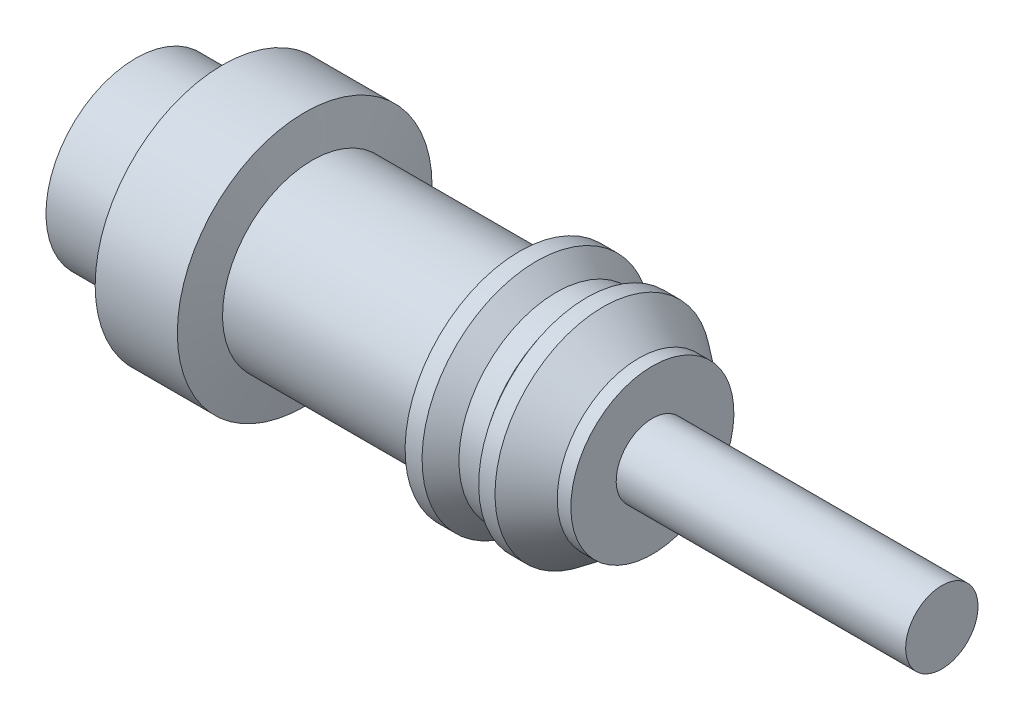
ISO-10303-21;
HEADER;
FILE_DESCRIPTION(('STEP AP214'),'2;1');
FILE_NAME('part.step','',(''),(''),'','','');
FILE_SCHEMA(('AUTOMOTIVE_DESIGN { 1 0 10303 214 1 1 1 1 }'));
ENDSEC;
DATA;
#1=APPLICATION_CONTEXT('core data for automotive mechanical design processes');
#2=APPLICATION_PROTOCOL_DEFINITION('international standard','automotive_design',2000,#1);
#3=PRODUCT_CONTEXT('',#1,'mechanical');
#4=PRODUCT('Part','Part','',(#3));
#5=PRODUCT_RELATED_PRODUCT_CATEGORY('part','',(#4));
#6=PRODUCT_DEFINITION_FORMATION('','',#4);
#7=PRODUCT_DEFINITION_CONTEXT('part definition',#1,'design');
#8=PRODUCT_DEFINITION('design','',#6,#7);
#9=PRODUCT_DEFINITION_SHAPE('','',#8);
#10=(LENGTH_UNIT() NAMED_UNIT(*) SI_UNIT(.MILLI.,.METRE.));
#11=(NAMED_UNIT(*) PLANE_ANGLE_UNIT() SI_UNIT($,.RADIAN.));
#12=(NAMED_UNIT(*) SI_UNIT($,.STERADIAN.) SOLID_ANGLE_UNIT());
#13=UNCERTAINTY_MEASURE_WITH_UNIT(LENGTH_MEASURE(1.E-05),#10,'distance_accuracy_value','');
#14=(GEOMETRIC_REPRESENTATION_CONTEXT(3) GLOBAL_UNCERTAINTY_ASSIGNED_CONTEXT((#13)) GLOBAL_UNIT_ASSIGNED_CONTEXT((#10,
#11,#12)) REPRESENTATION_CONTEXT('',''));
#15=CARTESIAN_POINT('',(0.,0.,0.));
#16=DIRECTION('',(0.,0.,1.));
#17=DIRECTION('',(1.,0.,0.));
#18=AXIS2_PLACEMENT_3D('',#15,#16,#17);
#19=CARTESIAN_POINT('',(35.7,5.63390819513866,0.));
#20=DIRECTION('',(1.,0.,0.));
#21=DIRECTION('',(0.,1.,0.));
#22=AXIS2_PLACEMENT_3D('',#19,#20,#21);
#23=PLANE('',#22);
#24=CARTESIAN_POINT('',(35.7,0.,0.));
#25=DIRECTION('',(1.,0.,0.));
#26=DIRECTION('',(0.,1.,0.));
#27=AXIS2_PLACEMENT_3D('',#24,#25,#26);
#28=CIRCLE('',#27,5.63390819513867);
#29=CARTESIAN_POINT('',(35.7,5.63390819513866,0.));
#30=VERTEX_POINT('',#29);
#31=EDGE_CURVE('E80',#30,#30,#28,.T.);
#32=ORIENTED_EDGE('',*,*,#31,.T.);
#33=EDGE_LOOP('',(#32));
#34=FACE_BOUND('',#33,.T.);
#35=CARTESIAN_POINT('',(35.7,0.,0.));
#36=DIRECTION('',(1.,0.,0.));
#37=DIRECTION('',(0.,1.,0.));
#38=AXIS2_PLACEMENT_3D('',#35,#36,#37);
#39=CIRCLE('',#38,2.5);
#40=CARTESIAN_POINT('',(35.7,2.5,0.));
#41=VERTEX_POINT('',#40);
#42=EDGE_CURVE('E90',#41,#41,#39,.T.);
#43=ORIENTED_EDGE('',*,*,#42,.F.);
#44=EDGE_LOOP('',(#43));
#45=FACE_BOUND('',#44,.T.);
#46=ADVANCED_FACE('F33',(#34,#45),#23,.T.);
#47=CARTESIAN_POINT('',(0.,0.,0.));
#48=DIRECTION('',(-1.,0.,0.));
#49=DIRECTION('',(0.,-1.,0.));
#50=AXIS2_PLACEMENT_3D('',#47,#48,#49);
#51=PLANE('',#50);
#52=CARTESIAN_POINT('',(0.,0.,0.));
#53=DIRECTION('',(-1.,0.,0.));
#54=DIRECTION('',(0.,-1.,0.));
#55=AXIS2_PLACEMENT_3D('',#52,#53,#54);
#56=CIRCLE('',#55,5.2);
#57=CARTESIAN_POINT('',(0.,-5.2,0.));
#58=VERTEX_POINT('',#57);
#59=EDGE_CURVE('E84',#58,#58,#56,.T.);
#60=ORIENTED_EDGE('',*,*,#59,.F.);
#61=EDGE_LOOP('',(#60));
#62=FACE_BOUND('',#61,.T.);
#63=CARTESIAN_POINT('',(0.,0.,0.));
#64=DIRECTION('',(1.,0.,0.));
#65=DIRECTION('',(0.,1.,0.));
#66=AXIS2_PLACEMENT_3D('',#63,#64,#65);
#67=CIRCLE('',#66,6.19999999999999);
#68=CARTESIAN_POINT('',(0.,6.19999999999999,0.));
#69=VERTEX_POINT('',#68);
#70=EDGE_CURVE('E10',#69,#69,#67,.T.);
#71=ORIENTED_EDGE('',*,*,#70,.F.);
#72=EDGE_LOOP('',(#71));
#73=FACE_BOUND('',#72,.T.);
#74=ADVANCED_FACE('F35',(#62,#73),#51,.T.);
#75=CARTESIAN_POINT('',(35.7,0.,0.));
#76=DIRECTION('',(1.,0.,0.));
#77=DIRECTION('',(0.,1.,0.));
#78=AXIS2_PLACEMENT_3D('',#75,#76,#77);
#79=CYLINDRICAL_SURFACE('',#78,6.19999999999999);
#80=ORIENTED_EDGE('',*,*,#70,.T.);
#81=EDGE_LOOP('',(#80));
#82=FACE_BOUND('',#81,.T.);
#83=CARTESIAN_POINT('',(6.,0.,0.));
#84=DIRECTION('',(1.,0.,0.));
#85=DIRECTION('',(0.,1.,0.));
#86=AXIS2_PLACEMENT_3D('',#83,#84,#85);
#87=CIRCLE('',#86,6.19999999999999);
#88=CARTESIAN_POINT('',(6.,6.19999999999999,0.));
#89=VERTEX_POINT('',#88);
#90=EDGE_CURVE('E40',#89,#89,#87,.T.);
#91=ORIENTED_EDGE('',*,*,#90,.F.);
#92=EDGE_LOOP('',(#91));
#93=FACE_BOUND('',#92,.T.);
#94=ADVANCED_FACE('F113',(#82,#93),#79,.T.);
#95=CARTESIAN_POINT('',(6.,6.19999999999999,0.));
#96=DIRECTION('',(-1.,0.,0.));
#97=DIRECTION('',(0.,-1.,0.));
#98=AXIS2_PLACEMENT_3D('',#95,#96,#97);
#99=PLANE('',#98);
#100=ORIENTED_EDGE('',*,*,#90,.T.);
#101=EDGE_LOOP('',(#100));
#102=FACE_BOUND('',#101,.T.);
#103=CARTESIAN_POINT('',(6.,0.,0.));
#104=DIRECTION('',(1.,0.,0.));
#105=DIRECTION('',(0.,1.,0.));
#106=AXIS2_PLACEMENT_3D('',#103,#104,#105);
#107=CIRCLE('',#106,8.8);
#108=CARTESIAN_POINT('',(6.,8.8,0.));
#109=VERTEX_POINT('',#108);
#110=EDGE_CURVE('E44',#109,#109,#107,.T.);
#111=ORIENTED_EDGE('',*,*,#110,.F.);
#112=EDGE_LOOP('',(#111));
#113=FACE_BOUND('',#112,.T.);
#114=ADVANCED_FACE('F162',(#102,#113),#99,.T.);
#115=CARTESIAN_POINT('',(35.7,0.,0.));
#116=DIRECTION('',(1.,0.,0.));
#117=DIRECTION('',(0.,1.,0.));
#118=AXIS2_PLACEMENT_3D('',#115,#116,#117);
#119=CYLINDRICAL_SURFACE('',#118,8.8);
#120=ORIENTED_EDGE('',*,*,#110,.T.);
#121=EDGE_LOOP('',(#120));
#122=FACE_BOUND('',#121,.T.);
#123=CARTESIAN_POINT('',(11.6769496714396,0.,0.));
#124=DIRECTION('',(1.,0.,0.));
#125=DIRECTION('',(0.,1.,0.));
#126=AXIS2_PLACEMENT_3D('',#123,#124,#125);
#127=CIRCLE('',#126,8.8);
#128=CARTESIAN_POINT('',(11.6769496714396,8.8,0.));
#129=VERTEX_POINT('',#128);
#130=EDGE_CURVE('E48',#129,#129,#127,.T.);
#131=ORIENTED_EDGE('',*,*,#130,.F.);
#132=EDGE_LOOP('',(#131));
#133=FACE_BOUND('',#132,.T.);
#134=ADVANCED_FACE('F158',(#122,#133),#119,.T.);
#135=CARTESIAN_POINT('',(12.2,0.,0.));
#136=DIRECTION('',(-1.,0.,0.));
#137=DIRECTION('',(0.,-1.,0.));
#138=AXIS2_PLACEMENT_3D('',#135,#136,#137);
#139=CONICAL_SURFACE('',#138,6.2,1.37227294178984);
#140=ORIENTED_EDGE('',*,*,#130,.T.);
#141=EDGE_LOOP('',(#140));
#142=FACE_BOUND('',#141,.T.);
#143=CARTESIAN_POINT('',(12.2,0.,0.));
#144=DIRECTION('',(1.,0.,0.));
#145=DIRECTION('',(0.,1.,0.));
#146=AXIS2_PLACEMENT_3D('',#143,#144,#145);
#147=CIRCLE('',#146,6.2);
#148=CARTESIAN_POINT('',(12.2,6.2,0.));
#149=VERTEX_POINT('',#148);
#150=EDGE_CURVE('E53',#149,#149,#147,.T.);
#151=ORIENTED_EDGE('',*,*,#150,.F.);
#152=EDGE_LOOP('',(#151));
#153=FACE_BOUND('',#152,.T.);
#154=ADVANCED_FACE('F154',(#142,#153),#139,.T.);
#155=CARTESIAN_POINT('',(35.7,0.,0.));
#156=DIRECTION('',(1.,0.,0.));
#157=DIRECTION('',(0.,1.,0.));
#158=AXIS2_PLACEMENT_3D('',#155,#156,#157);
#159=CYLINDRICAL_SURFACE('',#158,6.2);
#160=ORIENTED_EDGE('',*,*,#150,.T.);
#161=EDGE_LOOP('',(#160));
#162=FACE_BOUND('',#161,.T.);
#163=CARTESIAN_POINT('',(26.5230393745187,0.,0.));
#164=DIRECTION('',(1.,0.,0.));
#165=DIRECTION('',(0.,1.,0.));
#166=AXIS2_PLACEMENT_3D('',#163,#164,#165);
#167=CIRCLE('',#166,6.2);
#168=CARTESIAN_POINT('',(26.5230393745187,6.2,0.));
#169=VERTEX_POINT('',#168);
#170=EDGE_CURVE('E56',#169,#169,#167,.T.);
#171=ORIENTED_EDGE('',*,*,#170,.F.);
#172=EDGE_LOOP('',(#171));
#173=FACE_BOUND('',#172,.T.);
#174=ADVANCED_FACE('F150',(#162,#173),#159,.T.);
#175=CARTESIAN_POINT('',(26.5230393745187,6.2,0.));
#176=DIRECTION('',(-1.,0.,0.));
#177=DIRECTION('',(0.,-1.,0.));
#178=AXIS2_PLACEMENT_3D('',#175,#176,#177);
#179=PLANE('',#178);
#180=ORIENTED_EDGE('',*,*,#170,.T.);
#181=EDGE_LOOP('',(#180));
#182=FACE_BOUND('',#181,.T.);
#183=CARTESIAN_POINT('',(26.5230393745187,0.,0.));
#184=DIRECTION('',(1.,0.,0.));
#185=DIRECTION('',(0.,1.,0.));
#186=AXIS2_PLACEMENT_3D('',#183,#184,#185);
#187=CIRCLE('',#186,7.91006878962482);
#188=CARTESIAN_POINT('',(26.5230393745187,7.91006878962482,0.));
#189=VERTEX_POINT('',#188);
#190=EDGE_CURVE('E59',#189,#189,#187,.T.);
#191=ORIENTED_EDGE('',*,*,#190,.F.);
#192=EDGE_LOOP('',(#191));
#193=FACE_BOUND('',#192,.T.);
#194=ADVANCED_FACE('F146',(#182,#193),#179,.T.);
#195=CARTESIAN_POINT('',(35.7,0.,0.));
#196=DIRECTION('',(1.,0.,0.));
#197=DIRECTION('',(0.,1.,0.));
#198=AXIS2_PLACEMENT_3D('',#195,#196,#197);
#199=CYLINDRICAL_SURFACE('',#198,7.91006878962482);
#200=ORIENTED_EDGE('',*,*,#190,.T.);
#201=EDGE_LOOP('',(#200));
#202=FACE_BOUND('',#201,.T.);
#203=CARTESIAN_POINT('',(27.6957666837251,0.,0.));
#204=DIRECTION('',(1.,0.,0.));
#205=DIRECTION('',(0.,1.,0.));
#206=AXIS2_PLACEMENT_3D('',#203,#204,#205);
#207=CIRCLE('',#206,7.91006878962482);
#208=CARTESIAN_POINT('',(27.6957666837251,7.91006878962482,0.));
#209=VERTEX_POINT('',#208);
#210=EDGE_CURVE('E62',#209,#209,#207,.T.);
#211=ORIENTED_EDGE('',*,*,#210,.F.);
#212=EDGE_LOOP('',(#211));
#213=FACE_BOUND('',#212,.T.);
#214=ADVANCED_FACE('F142',(#202,#213),#199,.T.);
#215=CARTESIAN_POINT('',(29.0591902980919,0.,0.));
#216=DIRECTION('',(-1.,0.,0.));
#217=DIRECTION('',(0.,-1.,0.));
#218=AXIS2_PLACEMENT_3D('',#215,#216,#217);
#219=CONICAL_SURFACE('',#218,6.72529228260939,0.715405511910955);
#220=ORIENTED_EDGE('',*,*,#210,.T.);
#221=EDGE_LOOP('',(#220));
#222=FACE_BOUND('',#221,.T.);
#223=CARTESIAN_POINT('',(29.0591902980919,0.,0.));
#224=DIRECTION('',(1.,0.,0.));
#225=DIRECTION('',(0.,1.,0.));
#226=AXIS2_PLACEMENT_3D('',#223,#224,#225);
#227=CIRCLE('',#226,6.72529228260939);
#228=CARTESIAN_POINT('',(29.0591902980919,6.72529228260939,0.));
#229=VERTEX_POINT('',#228);
#230=EDGE_CURVE('E65',#229,#229,#227,.T.);
#231=ORIENTED_EDGE('',*,*,#230,.F.);
#232=EDGE_LOOP('',(#231));
#233=FACE_BOUND('',#232,.T.);
#234=ADVANCED_FACE('F138',(#222,#233),#219,.T.);
#235=CARTESIAN_POINT('',(35.7,0.,0.));
#236=DIRECTION('',(1.,0.,0.));
#237=DIRECTION('',(0.,1.,0.));
#238=AXIS2_PLACEMENT_3D('',#235,#236,#237);
#239=CYLINDRICAL_SURFACE('',#238,6.72529228260939);
#240=ORIENTED_EDGE('',*,*,#230,.T.);
#241=EDGE_LOOP('',(#240));
#242=FACE_BOUND('',#241,.T.);
#243=CARTESIAN_POINT('',(30.614076116678,0.,0.));
#244=DIRECTION('',(1.,0.,0.));
#245=DIRECTION('',(0.,1.,0.));
#246=AXIS2_PLACEMENT_3D('',#243,#244,#245);
#247=CIRCLE('',#246,6.72529228260939);
#248=CARTESIAN_POINT('',(30.614076116678,6.72529228260939,0.));
#249=VERTEX_POINT('',#248);
#250=EDGE_CURVE('E68',#249,#249,#247,.T.);
#251=ORIENTED_EDGE('',*,*,#250,.F.);
#252=EDGE_LOOP('',(#251));
#253=FACE_BOUND('',#252,.T.);
#254=ADVANCED_FACE('F134',(#242,#253),#239,.T.);
#255=CARTESIAN_POINT('',(31.1695332995503,0.,0.));
#256=DIRECTION('',(1.,0.,0.));
#257=DIRECTION('',(0.,1.,0.));
#258=AXIS2_PLACEMENT_3D('',#255,#256,#257);
#259=CONICAL_SURFACE('',#258,7.470731504212,0.930412362158355);
#260=ORIENTED_EDGE('',*,*,#250,.T.);
#261=EDGE_LOOP('',(#260));
#262=FACE_BOUND('',#261,.T.);
#263=CARTESIAN_POINT('',(31.1695332995503,0.,0.));
#264=DIRECTION('',(1.,0.,0.));
#265=DIRECTION('',(0.,1.,0.));
#266=AXIS2_PLACEMENT_3D('',#263,#264,#265);
#267=CIRCLE('',#266,7.470731504212);
#268=CARTESIAN_POINT('',(31.1695332995503,7.470731504212,0.));
#269=VERTEX_POINT('',#268);
#270=EDGE_CURVE('E71',#269,#269,#267,.T.);
#271=ORIENTED_EDGE('',*,*,#270,.F.);
#272=EDGE_LOOP('',(#271));
#273=FACE_BOUND('',#272,.T.);
#274=ADVANCED_FACE('F130',(#262,#273),#259,.T.);
#275=CARTESIAN_POINT('',(35.7,0.,0.));
#276=DIRECTION('',(1.,0.,0.));
#277=DIRECTION('',(0.,1.,0.));
#278=AXIS2_PLACEMENT_3D('',#275,#276,#277);
#279=CYLINDRICAL_SURFACE('',#278,7.470731504212);
#280=ORIENTED_EDGE('',*,*,#270,.T.);
#281=EDGE_LOOP('',(#280));
#282=FACE_BOUND('',#281,.T.);
#283=CARTESIAN_POINT('',(32.294644918721,0.,0.));
#284=DIRECTION('',(1.,0.,0.));
#285=DIRECTION('',(0.,1.,0.));
#286=AXIS2_PLACEMENT_3D('',#283,#284,#285);
#287=CIRCLE('',#286,7.470731504212);
#288=CARTESIAN_POINT('',(32.294644918721,7.470731504212,0.));
#289=VERTEX_POINT('',#288);
#290=EDGE_CURVE('E74',#289,#289,#287,.T.);
#291=ORIENTED_EDGE('',*,*,#290,.F.);
#292=EDGE_LOOP('',(#291));
#293=FACE_BOUND('',#292,.T.);
#294=ADVANCED_FACE('F126',(#282,#293),#279,.T.);
#295=CARTESIAN_POINT('',(34.7597136584154,0.,0.));
#296=DIRECTION('',(-1.,0.,0.));
#297=DIRECTION('',(0.,-1.,0.));
#298=AXIS2_PLACEMENT_3D('',#295,#296,#297);
#299=CONICAL_SURFACE('',#298,5.63390819513867,0.640383964636542);
#300=ORIENTED_EDGE('',*,*,#290,.T.);
#301=EDGE_LOOP('',(#300));
#302=FACE_BOUND('',#301,.T.);
#303=CARTESIAN_POINT('',(34.7597136584154,0.,0.));
#304=DIRECTION('',(1.,0.,0.));
#305=DIRECTION('',(0.,1.,0.));
#306=AXIS2_PLACEMENT_3D('',#303,#304,#305);
#307=CIRCLE('',#306,5.63390819513867);
#308=CARTESIAN_POINT('',(34.7597136584154,5.63390819513866,0.));
#309=VERTEX_POINT('',#308);
#310=EDGE_CURVE('E77',#309,#309,#307,.T.);
#311=ORIENTED_EDGE('',*,*,#310,.F.);
#312=EDGE_LOOP('',(#311));
#313=FACE_BOUND('',#312,.T.);
#314=ADVANCED_FACE('F122',(#302,#313),#299,.T.);
#315=CARTESIAN_POINT('',(35.7,0.,0.));
#316=DIRECTION('',(1.,0.,0.));
#317=DIRECTION('',(0.,1.,0.));
#318=AXIS2_PLACEMENT_3D('',#315,#316,#317);
#319=CYLINDRICAL_SURFACE('',#318,5.63390819513867);
#320=ORIENTED_EDGE('',*,*,#310,.T.);
#321=EDGE_LOOP('',(#320));
#322=FACE_BOUND('',#321,.T.);
#323=ORIENTED_EDGE('',*,*,#31,.F.);
#324=EDGE_LOOP('',(#323));
#325=FACE_BOUND('',#324,.T.);
#326=ADVANCED_FACE('F119',(#322,#325),#319,.T.);
#327=CARTESIAN_POINT('',(6.,0.,0.));
#328=DIRECTION('',(-1.,0.,0.));
#329=DIRECTION('',(0.,-1.,0.));
#330=AXIS2_PLACEMENT_3D('',#327,#328,#329);
#331=CYLINDRICAL_SURFACE('',#330,5.2);
#332=CARTESIAN_POINT('',(6.,0.,0.));
#333=DIRECTION('',(-1.,0.,0.));
#334=DIRECTION('',(0.,-1.,0.));
#335=AXIS2_PLACEMENT_3D('',#332,#333,#334);
#336=CIRCLE('',#335,5.2);
#337=CARTESIAN_POINT('',(6.,-5.2,0.));
#338=VERTEX_POINT('',#337);
#339=EDGE_CURVE('E83',#338,#338,#336,.T.);
#340=ORIENTED_EDGE('',*,*,#339,.F.);
#341=EDGE_LOOP('',(#340));
#342=FACE_BOUND('',#341,.T.);
#343=ORIENTED_EDGE('',*,*,#59,.T.);
#344=EDGE_LOOP('',(#343));
#345=FACE_BOUND('',#344,.T.);
#346=ADVANCED_FACE('F117',(#342,#345),#331,.F.);
#347=CARTESIAN_POINT('',(6.,0.,0.));
#348=DIRECTION('',(-1.,0.,0.));
#349=DIRECTION('',(0.,-1.,0.));
#350=AXIS2_PLACEMENT_3D('',#347,#348,#349);
#351=PLANE('',#350);
#352=ORIENTED_EDGE('',*,*,#339,.T.);
#353=EDGE_LOOP('',(#352));
#354=FACE_BOUND('',#353,.T.);
#355=ADVANCED_FACE('F101',(#354),#351,.T.);
#356=CARTESIAN_POINT('',(55.7,0.,0.));
#357=DIRECTION('',(-1.,0.,0.));
#358=DIRECTION('',(0.,-1.,0.));
#359=AXIS2_PLACEMENT_3D('',#356,#357,#358);
#360=CYLINDRICAL_SURFACE('',#359,2.5);
#361=CARTESIAN_POINT('',(55.7,0.,0.));
#362=DIRECTION('',(1.,0.,0.));
#363=DIRECTION('',(0.,1.,0.));
#364=AXIS2_PLACEMENT_3D('',#361,#362,#363);
#365=CIRCLE('',#364,2.5);
#366=CARTESIAN_POINT('',(55.7,2.5,0.));
#367=VERTEX_POINT('',#366);
#368=EDGE_CURVE('E87',#367,#367,#365,.T.);
#369=ORIENTED_EDGE('',*,*,#368,.F.);
#370=EDGE_LOOP('',(#369));
#371=FACE_BOUND('',#370,.T.);
#372=ORIENTED_EDGE('',*,*,#42,.T.);
#373=EDGE_LOOP('',(#372));
#374=FACE_BOUND('',#373,.T.);
#375=ADVANCED_FACE('F98',(#371,#374),#360,.T.);
#376=CARTESIAN_POINT('',(55.7,0.,0.));
#377=DIRECTION('',(1.,0.,0.));
#378=DIRECTION('',(0.,1.,0.));
#379=AXIS2_PLACEMENT_3D('',#376,#377,#378);
#380=PLANE('',#379);
#381=ORIENTED_EDGE('',*,*,#368,.T.);
#382=EDGE_LOOP('',(#381));
#383=FACE_BOUND('',#382,.T.);
#384=ADVANCED_FACE('F96',(#383),#380,.T.);
#385=CLOSED_SHELL('',(#46,#74,#94,#114,#134,#154,#174,#194,#214,#234,#254,#274,#294,#314,#326,
#346,#355,#375,#384));
#386=MANIFOLD_SOLID_BREP('B2',#385);
#387=ADVANCED_BREP_SHAPE_REPRESENTATION('',(#18,#386),#14);
#388=SHAPE_DEFINITION_REPRESENTATION(#9,#387);
ENDSEC;
END-ISO-10303-21;
